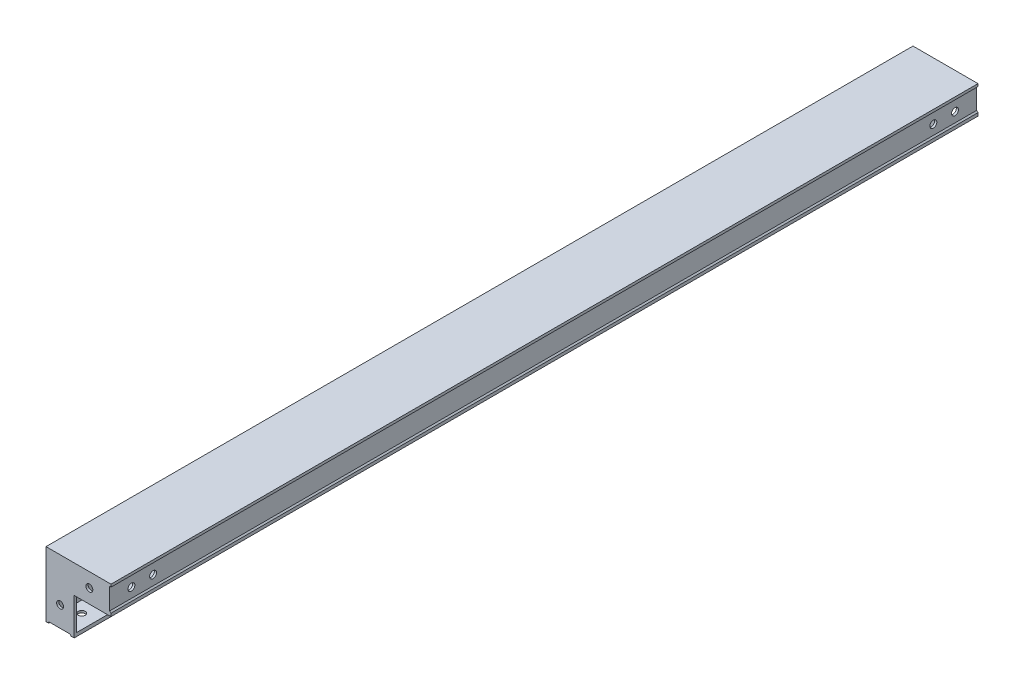
ISO-10303-21;
HEADER;
FILE_DESCRIPTION(('STEP AP214'),'2;1');
FILE_NAME('part.step','',(''),(''),'','','');
FILE_SCHEMA(('AUTOMOTIVE_DESIGN { 1 0 10303 214 1 1 1 1 }'));
ENDSEC;
DATA;
#1=APPLICATION_CONTEXT('core data for automotive mechanical design processes');
#2=APPLICATION_PROTOCOL_DEFINITION('international standard','automotive_design',2000,#1);
#3=PRODUCT_CONTEXT('',#1,'mechanical');
#4=PRODUCT('Part','Part','',(#3));
#5=PRODUCT_RELATED_PRODUCT_CATEGORY('part','',(#4));
#6=PRODUCT_DEFINITION_FORMATION('','',#4);
#7=PRODUCT_DEFINITION_CONTEXT('part definition',#1,'design');
#8=PRODUCT_DEFINITION('design','',#6,#7);
#9=PRODUCT_DEFINITION_SHAPE('','',#8);
#10=(LENGTH_UNIT() NAMED_UNIT(*) SI_UNIT(.MILLI.,.METRE.));
#11=(NAMED_UNIT(*) PLANE_ANGLE_UNIT() SI_UNIT($,.RADIAN.));
#12=(NAMED_UNIT(*) SI_UNIT($,.STERADIAN.) SOLID_ANGLE_UNIT());
#13=UNCERTAINTY_MEASURE_WITH_UNIT(LENGTH_MEASURE(1.E-05),#10,'distance_accuracy_value','');
#14=(GEOMETRIC_REPRESENTATION_CONTEXT(3) GLOBAL_UNCERTAINTY_ASSIGNED_CONTEXT((#13)) GLOBAL_UNIT_ASSIGNED_CONTEXT((#10,
#11,#12)) REPRESENTATION_CONTEXT('',''));
#15=CARTESIAN_POINT('',(0.,0.,0.));
#16=DIRECTION('',(0.,0.,1.));
#17=DIRECTION('',(1.,0.,0.));
#18=AXIS2_PLACEMENT_3D('',#15,#16,#17);
#19=CARTESIAN_POINT('',(54.9999999999997,-146.999999999985,2000.));
#20=DIRECTION('',(0.,1.,0.));
#21=DIRECTION('',(0.,0.,1.));
#22=AXIS2_PLACEMENT_3D('',#19,#20,#21);
#23=PLANE('',#22);
#24=CARTESIAN_POINT('',(32.5,-146.999999999985,1950.));
#25=DIRECTION('',(0.,-1.,0.));
#26=DIRECTION('',(0.,0.,-1.));
#27=AXIS2_PLACEMENT_3D('',#24,#25,#26);
#28=CIRCLE('',#27,7.99999999999999);
#29=CARTESIAN_POINT('',(32.5,-146.999999999985,1942.));
#30=VERTEX_POINT('',#29);
#31=EDGE_CURVE('E413',#30,#30,#28,.T.);
#32=ORIENTED_EDGE('',*,*,#31,.F.);
#33=EDGE_LOOP('',(#32));
#34=FACE_BOUND('',#33,.T.);
#35=CARTESIAN_POINT('',(32.5,-146.999999999985,50.));
#36=DIRECTION('',(0.,-1.,0.));
#37=DIRECTION('',(0.,0.,-1.));
#38=AXIS2_PLACEMENT_3D('',#35,#36,#37);
#39=CIRCLE('',#38,7.99999999999999);
#40=CARTESIAN_POINT('',(32.5,-146.999999999985,42.));
#41=VERTEX_POINT('',#40);
#42=EDGE_CURVE('E401',#41,#41,#39,.T.);
#43=ORIENTED_EDGE('',*,*,#42,.F.);
#44=EDGE_LOOP('',(#43));
#45=FACE_BOUND('',#44,.T.);
#46=CARTESIAN_POINT('',(32.5,-146.999999999985,100.));
#47=DIRECTION('',(0.,-1.,0.));
#48=DIRECTION('',(0.,0.,-1.));
#49=AXIS2_PLACEMENT_3D('',#46,#47,#48);
#50=CIRCLE('',#49,7.99999999999999);
#51=CARTESIAN_POINT('',(32.5,-146.999999999985,92.));
#52=VERTEX_POINT('',#51);
#53=EDGE_CURVE('E395',#52,#52,#50,.T.);
#54=ORIENTED_EDGE('',*,*,#53,.F.);
#55=EDGE_LOOP('',(#54));
#56=FACE_BOUND('',#55,.T.);
#57=DIRECTION('',(1.,0.,0.));
#58=VECTOR('',#57,1.);
#59=CARTESIAN_POINT('',(54.9999999999997,-146.999999999985,0.));
#60=LINE('',#59,#58);
#61=CARTESIAN_POINT('',(5.9999999999707,-146.999999999985,0.));
#62=VERTEX_POINT('',#61);
#63=CARTESIAN_POINT('',(54.9999999999997,-146.999999999985,0.));
#64=VERTEX_POINT('',#63);
#65=EDGE_CURVE('E290',#62,#64,#60,.T.);
#66=ORIENTED_EDGE('',*,*,#65,.T.);
#67=DIRECTION('',(0.,0.,-1.));
#68=VECTOR('',#67,1.);
#69=CARTESIAN_POINT('',(54.9999999999997,-146.999999999985,2000.));
#70=LINE('',#69,#68);
#71=CARTESIAN_POINT('',(54.9999999999997,-146.999999999985,2000.));
#72=VERTEX_POINT('',#71);
#73=EDGE_CURVE('E308',#72,#64,#70,.T.);
#74=ORIENTED_EDGE('',*,*,#73,.F.);
#75=DIRECTION('',(1.,0.,0.));
#76=VECTOR('',#75,1.);
#77=CARTESIAN_POINT('',(54.9999999999997,-146.999999999985,2000.));
#78=LINE('',#77,#76);
#79=CARTESIAN_POINT('',(5.9999999999707,-146.999999999985,2000.));
#80=VERTEX_POINT('',#79);
#81=EDGE_CURVE('E261',#80,#72,#78,.T.);
#82=ORIENTED_EDGE('',*,*,#81,.F.);
#83=DIRECTION('',(0.,0.,-1.));
#84=VECTOR('',#83,1.);
#85=CARTESIAN_POINT('',(5.9999999999707,-146.999999999985,2000.));
#86=LINE('',#85,#84);
#87=EDGE_CURVE('E311',#80,#62,#86,.T.);
#88=ORIENTED_EDGE('',*,*,#87,.T.);
#89=EDGE_LOOP('',(#66,#74,#82,#88));
#90=FACE_BOUND('',#89,.T.);
#91=CARTESIAN_POINT('',(32.5,-146.999999999985,1900.));
#92=DIRECTION('',(0.,-1.,0.));
#93=DIRECTION('',(0.,0.,-1.));
#94=AXIS2_PLACEMENT_3D('',#91,#92,#93);
#95=CIRCLE('',#94,7.99999999999999);
#96=CARTESIAN_POINT('',(32.5,-146.999999999985,1892.));
#97=VERTEX_POINT('',#96);
#98=EDGE_CURVE('E407',#97,#97,#95,.T.);
#99=ORIENTED_EDGE('',*,*,#98,.F.);
#100=EDGE_LOOP('',(#99));
#101=FACE_BOUND('',#100,.T.);
#102=ADVANCED_FACE('F38',(#34,#45,#56,#90,#101),#23,.F.);
#103=CARTESIAN_POINT('',(147.000000000021,-6.00000000000021,2000.));
#104=DIRECTION('',(-1.,0.,0.));
#105=DIRECTION('',(0.,-1.,0.));
#106=AXIS2_PLACEMENT_3D('',#103,#104,#105);
#107=PLANE('',#106);
#108=CARTESIAN_POINT('',(147.000000000021,-32.5,100.));
#109=DIRECTION('',(1.,0.,0.));
#110=DIRECTION('',(0.,0.,-1.));
#111=AXIS2_PLACEMENT_3D('',#108,#109,#110);
#112=CIRCLE('',#111,7.99999999999999);
#113=CARTESIAN_POINT('',(147.000000000021,-32.5,92.));
#114=VERTEX_POINT('',#113);
#115=EDGE_CURVE('E371',#114,#114,#112,.T.);
#116=ORIENTED_EDGE('',*,*,#115,.F.);
#117=EDGE_LOOP('',(#116));
#118=FACE_BOUND('',#117,.T.);
#119=DIRECTION('',(0.,1.,0.));
#120=VECTOR('',#119,1.);
#121=CARTESIAN_POINT('',(147.000000000021,-6.00000000000021,0.));
#122=LINE('',#121,#120);
#123=CARTESIAN_POINT('',(147.000000000021,-55.0000000000175,0.));
#124=VERTEX_POINT('',#123);
#125=CARTESIAN_POINT('',(147.000000000021,-6.00000000000021,0.));
#126=VERTEX_POINT('',#125);
#127=EDGE_CURVE('E276',#124,#126,#122,.T.);
#128=ORIENTED_EDGE('',*,*,#127,.T.);
#129=DIRECTION('',(0.,0.,-1.));
#130=VECTOR('',#129,1.);
#131=CARTESIAN_POINT('',(147.000000000021,-6.00000000000021,2000.));
#132=LINE('',#131,#130);
#133=CARTESIAN_POINT('',(147.000000000021,-6.00000000000021,2000.));
#134=VERTEX_POINT('',#133);
#135=EDGE_CURVE('E329',#134,#126,#132,.T.);
#136=ORIENTED_EDGE('',*,*,#135,.F.);
#137=DIRECTION('',(0.,1.,0.));
#138=VECTOR('',#137,1.);
#139=CARTESIAN_POINT('',(147.000000000021,-6.00000000000021,2000.));
#140=LINE('',#139,#138);
#141=CARTESIAN_POINT('',(147.000000000021,-55.0000000000175,2000.));
#142=VERTEX_POINT('',#141);
#143=EDGE_CURVE('E247',#142,#134,#140,.T.);
#144=ORIENTED_EDGE('',*,*,#143,.F.);
#145=DIRECTION('',(0.,0.,-1.));
#146=VECTOR('',#145,1.);
#147=CARTESIAN_POINT('',(147.000000000021,-55.0000000000175,2000.));
#148=LINE('',#147,#146);
#149=EDGE_CURVE('E332',#142,#124,#148,.T.);
#150=ORIENTED_EDGE('',*,*,#149,.T.);
#151=EDGE_LOOP('',(#128,#136,#144,#150));
#152=FACE_BOUND('',#151,.T.);
#153=CARTESIAN_POINT('',(147.000000000021,-32.5,50.));
#154=DIRECTION('',(1.,0.,0.));
#155=DIRECTION('',(0.,0.,-1.));
#156=AXIS2_PLACEMENT_3D('',#153,#154,#155);
#157=CIRCLE('',#156,7.99999999999999);
#158=CARTESIAN_POINT('',(147.000000000021,-32.5,42.));
#159=VERTEX_POINT('',#158);
#160=EDGE_CURVE('E377',#159,#159,#157,.T.);
#161=ORIENTED_EDGE('',*,*,#160,.F.);
#162=EDGE_LOOP('',(#161));
#163=FACE_BOUND('',#162,.T.);
#164=CARTESIAN_POINT('',(147.000000000021,-32.5,1900.));
#165=DIRECTION('',(1.,0.,0.));
#166=DIRECTION('',(0.,0.,-1.));
#167=AXIS2_PLACEMENT_3D('',#164,#165,#166);
#168=CIRCLE('',#167,7.99999999999999);
#169=CARTESIAN_POINT('',(147.000000000021,-32.5,1892.));
#170=VERTEX_POINT('',#169);
#171=EDGE_CURVE('E383',#170,#170,#168,.T.);
#172=ORIENTED_EDGE('',*,*,#171,.F.);
#173=EDGE_LOOP('',(#172));
#174=FACE_BOUND('',#173,.T.);
#175=CARTESIAN_POINT('',(147.000000000021,-32.5,1950.));
#176=DIRECTION('',(1.,0.,0.));
#177=DIRECTION('',(0.,0.,-1.));
#178=AXIS2_PLACEMENT_3D('',#175,#176,#177);
#179=CIRCLE('',#178,7.99999999999999);
#180=CARTESIAN_POINT('',(147.000000000021,-32.5,1942.));
#181=VERTEX_POINT('',#180);
#182=EDGE_CURVE('E389',#181,#181,#179,.T.);
#183=ORIENTED_EDGE('',*,*,#182,.F.);
#184=EDGE_LOOP('',(#183));
#185=FACE_BOUND('',#184,.T.);
#186=ADVANCED_FACE('F421',(#118,#152,#163,#174,#185),#107,.F.);
#187=CARTESIAN_POINT('',(8.99999999995733,-8.99999999998687,2000.));
#188=DIRECTION('',(0.,0.,-1.));
#189=DIRECTION('',(-1.,0.,0.));
#190=AXIS2_PLACEMENT_3D('',#187,#188,#189);
#191=CYLINDRICAL_SURFACE('',#190,2.99999999998663);
#192=DIRECTION('',(0.,0.,-1.));
#193=VECTOR('',#192,1.);
#194=CARTESIAN_POINT('',(5.9999999999707,-8.99999999998688,2000.));
#195=LINE('',#194,#193);
#196=CARTESIAN_POINT('',(5.9999999999707,-8.99999999998688,1995.));
#197=VERTEX_POINT('',#196);
#198=CARTESIAN_POINT('',(5.9999999999707,-8.99999999998688,4.99999999999989));
#199=VERTEX_POINT('',#198);
#200=EDGE_CURVE('E270',#197,#199,#195,.T.);
#201=ORIENTED_EDGE('',*,*,#200,.T.);
#202=CARTESIAN_POINT('',(8.99999999995733,-8.99999999998687,4.99999999999989));
#203=DIRECTION('',(0.,0.,1.));
#204=DIRECTION('',(1.,0.,0.));
#205=AXIS2_PLACEMENT_3D('',#202,#203,#204);
#206=CIRCLE('',#205,2.99999999998663);
#207=CARTESIAN_POINT('',(8.99999999995733,-6.00000000000025,4.99999999999989));
#208=VERTEX_POINT('',#207);
#209=EDGE_CURVE('E54',#199,#208,#206,.F.);
#210=ORIENTED_EDGE('',*,*,#209,.T.);
#211=DIRECTION('',(0.,0.,-1.));
#212=VECTOR('',#211,1.);
#213=CARTESIAN_POINT('',(8.99999999995733,-6.00000000000025,2000.));
#214=LINE('',#213,#212);
#215=CARTESIAN_POINT('',(8.99999999995733,-6.00000000000021,1995.));
#216=VERTEX_POINT('',#215);
#217=EDGE_CURVE('E11',#216,#208,#214,.T.);
#218=ORIENTED_EDGE('',*,*,#217,.F.);
#219=CARTESIAN_POINT('',(8.99999999995733,-8.99999999998687,1995.));
#220=DIRECTION('',(0.,0.,-1.));
#221=DIRECTION('',(-1.,0.,0.));
#222=AXIS2_PLACEMENT_3D('',#219,#220,#221);
#223=CIRCLE('',#222,2.99999999998663);
#224=EDGE_CURVE('E237',#216,#197,#223,.F.);
#225=ORIENTED_EDGE('',*,*,#224,.T.);
#226=EDGE_LOOP('',(#201,#210,#218,#225));
#227=FACE_BOUND('',#226,.T.);
#228=ADVANCED_FACE('F40',(#227),#191,.F.);
#229=CARTESIAN_POINT('',(8.99999999995733,-6.00000000000025,2000.));
#230=DIRECTION('',(0.,1.,0.));
#231=DIRECTION('',(-1.,0.,0.));
#232=AXIS2_PLACEMENT_3D('',#229,#230,#231);
#233=PLANE('',#232);
#234=ORIENTED_EDGE('',*,*,#217,.T.);
#235=DIRECTION('',(-1.,0.,0.));
#236=VECTOR('',#235,1.);
#237=CARTESIAN_POINT('',(5.9999999999707,-6.00000000000021,5.));
#238=LINE('',#237,#236);
#239=CARTESIAN_POINT('',(141.999999999995,-6.00000000000021,4.99999999999989));
#240=VERTEX_POINT('',#239);
#241=EDGE_CURVE('E60',#240,#208,#238,.T.);
#242=ORIENTED_EDGE('',*,*,#241,.F.);
#243=DIRECTION('',(0.,0.,-1.));
#244=VECTOR('',#243,1.);
#245=CARTESIAN_POINT('',(141.999999999995,-6.00000000000021,2000.));
#246=LINE('',#245,#244);
#247=CARTESIAN_POINT('',(141.999999999995,-6.00000000000021,1995.));
#248=VERTEX_POINT('',#247);
#249=EDGE_CURVE('E47',#248,#240,#246,.T.);
#250=ORIENTED_EDGE('',*,*,#249,.F.);
#251=DIRECTION('',(-1.,0.,0.));
#252=VECTOR('',#251,1.);
#253=CARTESIAN_POINT('',(5.9999999999707,-6.00000000000021,1995.));
#254=LINE('',#253,#252);
#255=EDGE_CURVE('E231',#248,#216,#254,.T.);
#256=ORIENTED_EDGE('',*,*,#255,.T.);
#257=EDGE_LOOP('',(#234,#242,#250,#256));
#258=FACE_BOUND('',#257,.T.);
#259=ADVANCED_FACE('F548',(#258),#233,.F.);
#260=CARTESIAN_POINT('',(141.999999999995,-64.9999999999834,2000.));
#261=DIRECTION('',(1.,0.,0.));
#262=DIRECTION('',(0.,0.,-1.));
#263=AXIS2_PLACEMENT_3D('',#260,#261,#262);
#264=PLANE('',#263);
#265=CARTESIAN_POINT('',(141.999999999995,-32.5,1950.));
#266=DIRECTION('',(1.,0.,0.));
#267=DIRECTION('',(0.,0.,-1.));
#268=AXIS2_PLACEMENT_3D('',#265,#266,#267);
#269=CIRCLE('',#268,7.99999999999999);
#270=CARTESIAN_POINT('',(141.999999999995,-32.5,1942.));
#271=VERTEX_POINT('',#270);
#272=EDGE_CURVE('E386',#271,#271,#269,.T.);
#273=ORIENTED_EDGE('',*,*,#272,.T.);
#274=EDGE_LOOP('',(#273));
#275=FACE_BOUND('',#274,.T.);
#276=CARTESIAN_POINT('',(141.999999999995,-32.5,1900.));
#277=DIRECTION('',(1.,0.,0.));
#278=DIRECTION('',(0.,0.,-1.));
#279=AXIS2_PLACEMENT_3D('',#276,#277,#278);
#280=CIRCLE('',#279,7.99999999999999);
#281=CARTESIAN_POINT('',(141.999999999995,-32.5,1892.));
#282=VERTEX_POINT('',#281);
#283=EDGE_CURVE('E380',#282,#282,#280,.T.);
#284=ORIENTED_EDGE('',*,*,#283,.T.);
#285=EDGE_LOOP('',(#284));
#286=FACE_BOUND('',#285,.T.);
#287=CARTESIAN_POINT('',(141.999999999995,-32.5,50.));
#288=DIRECTION('',(1.,0.,0.));
#289=DIRECTION('',(0.,0.,-1.));
#290=AXIS2_PLACEMENT_3D('',#287,#288,#289);
#291=CIRCLE('',#290,7.99999999999999);
#292=CARTESIAN_POINT('',(141.999999999995,-32.5,42.));
#293=VERTEX_POINT('',#292);
#294=EDGE_CURVE('E374',#293,#293,#291,.T.);
#295=ORIENTED_EDGE('',*,*,#294,.T.);
#296=EDGE_LOOP('',(#295));
#297=FACE_BOUND('',#296,.T.);
#298=CARTESIAN_POINT('',(141.999999999995,-32.5,100.));
#299=DIRECTION('',(1.,0.,0.));
#300=DIRECTION('',(0.,0.,-1.));
#301=AXIS2_PLACEMENT_3D('',#298,#299,#300);
#302=CIRCLE('',#301,7.99999999999999);
#303=CARTESIAN_POINT('',(141.999999999995,-32.5,92.));
#304=VERTEX_POINT('',#303);
#305=EDGE_CURVE('E368',#304,#304,#302,.T.);
#306=ORIENTED_EDGE('',*,*,#305,.T.);
#307=EDGE_LOOP('',(#306));
#308=FACE_BOUND('',#307,.T.);
#309=ORIENTED_EDGE('',*,*,#249,.T.);
#310=DIRECTION('',(0.,1.,0.));
#311=VECTOR('',#310,1.);
#312=CARTESIAN_POINT('',(141.999999999995,-64.9999999999834,5.));
#313=LINE('',#312,#311);
#314=CARTESIAN_POINT('',(141.999999999995,-64.9999999999834,4.99999999999989));
#315=VERTEX_POINT('',#314);
#316=EDGE_CURVE('E210',#315,#240,#313,.T.);
#317=ORIENTED_EDGE('',*,*,#316,.F.);
#318=DIRECTION('',(0.,0.,-1.));
#319=VECTOR('',#318,1.);
#320=CARTESIAN_POINT('',(141.999999999995,-64.9999999999834,2000.));
#321=LINE('',#320,#319);
#322=CARTESIAN_POINT('',(141.999999999995,-64.9999999999834,1995.));
#323=VERTEX_POINT('',#322);
#324=EDGE_CURVE('E209',#323,#315,#321,.T.);
#325=ORIENTED_EDGE('',*,*,#324,.F.);
#326=DIRECTION('',(0.,1.,0.));
#327=VECTOR('',#326,1.);
#328=CARTESIAN_POINT('',(141.999999999995,-64.9999999999834,1995.));
#329=LINE('',#328,#327);
#330=EDGE_CURVE('E228',#323,#248,#329,.T.);
#331=ORIENTED_EDGE('',*,*,#330,.T.);
#332=EDGE_LOOP('',(#309,#317,#325,#331));
#333=FACE_BOUND('',#332,.T.);
#334=ADVANCED_FACE('F343',(#275,#286,#297,#308,#333),#264,.F.);
#335=CARTESIAN_POINT('',(150.,-64.9999999999834,2000.));
#336=DIRECTION('',(0.,1.,0.));
#337=DIRECTION('',(0.,0.,1.));
#338=AXIS2_PLACEMENT_3D('',#335,#336,#337);
#339=PLANE('',#338);
#340=DIRECTION('',(1.,0.,0.));
#341=VECTOR('',#340,1.);
#342=CARTESIAN_POINT('',(150.,-64.9999999999834,0.));
#343=LINE('',#342,#341);
#344=CARTESIAN_POINT('',(64.9999999999995,-64.9999999999834,0.));
#345=VERTEX_POINT('',#344);
#346=CARTESIAN_POINT('',(150.,-64.9999999999834,0.));
#347=VERTEX_POINT('',#346);
#348=EDGE_CURVE('E240',#345,#347,#343,.T.);
#349=ORIENTED_EDGE('',*,*,#348,.T.);
#350=DIRECTION('',(0.,0.,-1.));
#351=VECTOR('',#350,1.);
#352=CARTESIAN_POINT('',(150.,-64.9999999999834,2000.));
#353=LINE('',#352,#351);
#354=CARTESIAN_POINT('',(150.,-64.9999999999834,2000.));
#355=VERTEX_POINT('',#354);
#356=EDGE_CURVE('E338',#355,#347,#353,.T.);
#357=ORIENTED_EDGE('',*,*,#356,.F.);
#358=DIRECTION('',(1.,0.,0.));
#359=VECTOR('',#358,1.);
#360=CARTESIAN_POINT('',(150.,-64.9999999999834,2000.));
#361=LINE('',#360,#359);
#362=CARTESIAN_POINT('',(64.9999999999995,-64.9999999999834,2000.));
#363=VERTEX_POINT('',#362);
#364=EDGE_CURVE('E241',#363,#355,#361,.T.);
#365=ORIENTED_EDGE('',*,*,#364,.F.);
#366=DIRECTION('',(0.,0.,1.));
#367=VECTOR('',#366,1.);
#368=CARTESIAN_POINT('',(64.9999999999995,-64.9999999999834,1995.));
#369=LINE('',#368,#367);
#370=CARTESIAN_POINT('',(64.9999999999995,-64.9999999999834,1995.));
#371=VERTEX_POINT('',#370);
#372=EDGE_CURVE('E234',#371,#363,#369,.T.);
#373=ORIENTED_EDGE('',*,*,#372,.F.);
#374=DIRECTION('',(1.,0.,0.));
#375=VECTOR('',#374,1.);
#376=CARTESIAN_POINT('',(141.999999999995,-64.9999999999834,1995.));
#377=LINE('',#376,#375);
#378=EDGE_CURVE('E226',#371,#323,#377,.T.);
#379=ORIENTED_EDGE('',*,*,#378,.T.);
#380=ORIENTED_EDGE('',*,*,#324,.T.);
#381=DIRECTION('',(1.,0.,0.));
#382=VECTOR('',#381,1.);
#383=CARTESIAN_POINT('',(141.999999999995,-64.9999999999834,5.));
#384=LINE('',#383,#382);
#385=CARTESIAN_POINT('',(64.9999999999995,-64.9999999999834,5.));
#386=VERTEX_POINT('',#385);
#387=EDGE_CURVE('E190',#386,#315,#384,.T.);
#388=ORIENTED_EDGE('',*,*,#387,.F.);
#389=DIRECTION('',(0.,0.,-1.));
#390=VECTOR('',#389,1.);
#391=CARTESIAN_POINT('',(64.9999999999995,-64.9999999999834,5.));
#392=LINE('',#391,#390);
#393=EDGE_CURVE('E197',#386,#345,#392,.T.);
#394=ORIENTED_EDGE('',*,*,#393,.T.);
#395=EDGE_LOOP('',(#349,#357,#365,#373,#379,#380,#388,#394));
#396=FACE_BOUND('',#395,.T.);
#397=ADVANCED_FACE('F206',(#396),#339,.F.);
#398=CARTESIAN_POINT('',(150.,-57.9999999999965,2000.));
#399=DIRECTION('',(-1.,0.,0.));
#400=DIRECTION('',(0.,0.,1.));
#401=AXIS2_PLACEMENT_3D('',#398,#399,#400);
#402=PLANE('',#401);
#403=DIRECTION('',(0.,1.,0.));
#404=VECTOR('',#403,1.);
#405=CARTESIAN_POINT('',(150.,-57.9999999999965,0.));
#406=LINE('',#405,#404);
#407=CARTESIAN_POINT('',(150.,-57.9999999999965,0.));
#408=VERTEX_POINT('',#407);
#409=EDGE_CURVE('E272',#347,#408,#406,.T.);
#410=ORIENTED_EDGE('',*,*,#409,.T.);
#411=DIRECTION('',(0.,0.,-1.));
#412=VECTOR('',#411,1.);
#413=CARTESIAN_POINT('',(150.,-57.9999999999965,2000.));
#414=LINE('',#413,#412);
#415=CARTESIAN_POINT('',(150.,-57.9999999999965,2000.));
#416=VERTEX_POINT('',#415);
#417=EDGE_CURVE('E335',#416,#408,#414,.T.);
#418=ORIENTED_EDGE('',*,*,#417,.F.);
#419=DIRECTION('',(0.,1.,0.));
#420=VECTOR('',#419,1.);
#421=CARTESIAN_POINT('',(150.,-57.9999999999965,2000.));
#422=LINE('',#421,#420);
#423=EDGE_CURVE('E243',#355,#416,#422,.T.);
#424=ORIENTED_EDGE('',*,*,#423,.F.);
#425=ORIENTED_EDGE('',*,*,#356,.T.);
#426=EDGE_LOOP('',(#410,#418,#424,#425));
#427=FACE_BOUND('',#426,.T.);
#428=ADVANCED_FACE('F540',(#427),#402,.F.);
#429=CARTESIAN_POINT('',(147.000000000021,-55.0000000000175,2000.));
#430=DIRECTION('',(-0.707106781186532,-0.707106781186563,0.));
#431=DIRECTION('',(0.707106781186563,-0.707106781186532,0.));
#432=AXIS2_PLACEMENT_3D('',#429,#430,#431);
#433=PLANE('',#432);
#434=DIRECTION('',(-0.707106781186563,0.707106781186532,0.));
#435=VECTOR('',#434,1.);
#436=CARTESIAN_POINT('',(147.000000000021,-55.0000000000175,0.));
#437=LINE('',#436,#435);
#438=EDGE_CURVE('E274',#408,#124,#437,.T.);
#439=ORIENTED_EDGE('',*,*,#438,.T.);
#440=ORIENTED_EDGE('',*,*,#149,.F.);
#441=DIRECTION('',(-0.707106781186563,0.707106781186532,0.));
#442=VECTOR('',#441,1.);
#443=CARTESIAN_POINT('',(147.000000000021,-55.0000000000175,2000.));
#444=LINE('',#443,#442);
#445=EDGE_CURVE('E245',#416,#142,#444,.T.);
#446=ORIENTED_EDGE('',*,*,#445,.F.);
#447=ORIENTED_EDGE('',*,*,#417,.T.);
#448=EDGE_LOOP('',(#439,#440,#446,#447));
#449=FACE_BOUND('',#448,.T.);
#450=ADVANCED_FACE('F533',(#449),#433,.F.);
#451=CARTESIAN_POINT('',(147.000000000021,-6.00000000000021,2000.));
#452=DIRECTION('',(0.,1.,0.));
#453=DIRECTION('',(-1.,0.,0.));
#454=AXIS2_PLACEMENT_3D('',#451,#452,#453);
#455=PLANE('',#454);
#456=DIRECTION('',(1.,0.,0.));
#457=VECTOR('',#456,1.);
#458=CARTESIAN_POINT('',(147.000000000021,-6.00000000000021,0.));
#459=LINE('',#458,#457);
#460=CARTESIAN_POINT('',(150.,-6.0000000000002,0.));
#461=VERTEX_POINT('',#460);
#462=EDGE_CURVE('E278',#126,#461,#459,.T.);
#463=ORIENTED_EDGE('',*,*,#462,.T.);
#464=DIRECTION('',(0.,0.,-1.));
#465=VECTOR('',#464,1.);
#466=CARTESIAN_POINT('',(150.,-6.0000000000002,2000.));
#467=LINE('',#466,#465);
#468=CARTESIAN_POINT('',(150.,-6.0000000000002,2000.));
#469=VERTEX_POINT('',#468);
#470=EDGE_CURVE('E326',#469,#461,#467,.T.);
#471=ORIENTED_EDGE('',*,*,#470,.F.);
#472=DIRECTION('',(1.,0.,0.));
#473=VECTOR('',#472,1.);
#474=CARTESIAN_POINT('',(147.000000000021,-6.00000000000021,2000.));
#475=LINE('',#474,#473);
#476=EDGE_CURVE('E249',#134,#469,#475,.T.);
#477=ORIENTED_EDGE('',*,*,#476,.F.);
#478=ORIENTED_EDGE('',*,*,#135,.T.);
#479=EDGE_LOOP('',(#463,#471,#477,#478));
#480=FACE_BOUND('',#479,.T.);
#481=ADVANCED_FACE('F529',(#480),#455,.F.);
#482=CARTESIAN_POINT('',(150.,0.,2000.));
#483=DIRECTION('',(-1.,0.,0.));
#484=DIRECTION('',(0.,0.,1.));
#485=AXIS2_PLACEMENT_3D('',#482,#483,#484);
#486=PLANE('',#485);
#487=DIRECTION('',(0.,1.,0.));
#488=VECTOR('',#487,1.);
#489=CARTESIAN_POINT('',(150.,0.,0.));
#490=LINE('',#489,#488);
#491=CARTESIAN_POINT('',(150.,0.,0.));
#492=VERTEX_POINT('',#491);
#493=EDGE_CURVE('E280',#461,#492,#490,.T.);
#494=ORIENTED_EDGE('',*,*,#493,.T.);
#495=DIRECTION('',(0.,0.,-1.));
#496=VECTOR('',#495,1.);
#497=CARTESIAN_POINT('',(150.,0.,2000.));
#498=LINE('',#497,#496);
#499=CARTESIAN_POINT('',(150.,0.,2000.));
#500=VERTEX_POINT('',#499);
#501=EDGE_CURVE('E323',#500,#492,#498,.T.);
#502=ORIENTED_EDGE('',*,*,#501,.F.);
#503=DIRECTION('',(0.,1.,0.));
#504=VECTOR('',#503,1.);
#505=CARTESIAN_POINT('',(150.,0.,2000.));
#506=LINE('',#505,#504);
#507=EDGE_CURVE('E251',#469,#500,#506,.T.);
#508=ORIENTED_EDGE('',*,*,#507,.F.);
#509=ORIENTED_EDGE('',*,*,#470,.T.);
#510=EDGE_LOOP('',(#494,#502,#508,#509));
#511=FACE_BOUND('',#510,.T.);
#512=ADVANCED_FACE('F525',(#511),#486,.F.);
#513=CARTESIAN_POINT('',(150.,0.,2000.));
#514=DIRECTION('',(0.,-1.,0.));
#515=DIRECTION('',(1.,0.,0.));
#516=AXIS2_PLACEMENT_3D('',#513,#514,#515);
#517=PLANE('',#516);
#518=DIRECTION('',(-1.,0.,0.));
#519=VECTOR('',#518,1.);
#520=CARTESIAN_POINT('',(150.,0.,0.));
#521=LINE('',#520,#519);
#522=CARTESIAN_POINT('',(0.,0.,0.));
#523=VERTEX_POINT('',#522);
#524=EDGE_CURVE('E282',#492,#523,#521,.T.);
#525=ORIENTED_EDGE('',*,*,#524,.T.);
#526=DIRECTION('',(0.,0.,-1.));
#527=VECTOR('',#526,1.);
#528=CARTESIAN_POINT('',(0.,0.,2000.));
#529=LINE('',#528,#527);
#530=CARTESIAN_POINT('',(0.,0.,2000.));
#531=VERTEX_POINT('',#530);
#532=EDGE_CURVE('E320',#531,#523,#529,.T.);
#533=ORIENTED_EDGE('',*,*,#532,.F.);
#534=DIRECTION('',(-1.,0.,0.));
#535=VECTOR('',#534,1.);
#536=CARTESIAN_POINT('',(150.,0.,2000.));
#537=LINE('',#536,#535);
#538=EDGE_CURVE('E253',#500,#531,#537,.T.);
#539=ORIENTED_EDGE('',*,*,#538,.F.);
#540=ORIENTED_EDGE('',*,*,#501,.T.);
#541=EDGE_LOOP('',(#525,#533,#539,#540));
#542=FACE_BOUND('',#541,.T.);
#543=ADVANCED_FACE('F521',(#542),#517,.F.);
#544=CARTESIAN_POINT('',(0.,-149.999999999985,2000.));
#545=DIRECTION('',(1.,0.,0.));
#546=DIRECTION('',(0.,0.,-1.));
#547=AXIS2_PLACEMENT_3D('',#544,#545,#546);
#548=PLANE('',#547);
#549=DIRECTION('',(0.,-1.,0.));
#550=VECTOR('',#549,1.);
#551=CARTESIAN_POINT('',(0.,-149.999999999985,0.));
#552=LINE('',#551,#550);
#553=CARTESIAN_POINT('',(0.,-149.999999999985,0.));
#554=VERTEX_POINT('',#553);
#555=EDGE_CURVE('E284',#523,#554,#552,.T.);
#556=ORIENTED_EDGE('',*,*,#555,.T.);
#557=DIRECTION('',(0.,0.,-1.));
#558=VECTOR('',#557,1.);
#559=CARTESIAN_POINT('',(0.,-149.999999999985,2000.));
#560=LINE('',#559,#558);
#561=CARTESIAN_POINT('',(0.,-149.999999999985,2000.));
#562=VERTEX_POINT('',#561);
#563=EDGE_CURVE('E317',#562,#554,#560,.T.);
#564=ORIENTED_EDGE('',*,*,#563,.F.);
#565=DIRECTION('',(0.,-1.,0.));
#566=VECTOR('',#565,1.);
#567=CARTESIAN_POINT('',(0.,-149.999999999985,2000.));
#568=LINE('',#567,#566);
#569=EDGE_CURVE('E255',#531,#562,#568,.T.);
#570=ORIENTED_EDGE('',*,*,#569,.F.);
#571=ORIENTED_EDGE('',*,*,#532,.T.);
#572=EDGE_LOOP('',(#556,#564,#570,#571));
#573=FACE_BOUND('',#572,.T.);
#574=ADVANCED_FACE('F517',(#573),#548,.F.);
#575=CARTESIAN_POINT('',(5.9999999999707,-149.999999999985,2000.));
#576=DIRECTION('',(0.,1.,0.));
#577=DIRECTION('',(0.,0.,1.));
#578=AXIS2_PLACEMENT_3D('',#575,#576,#577);
#579=PLANE('',#578);
#580=DIRECTION('',(1.,0.,0.));
#581=VECTOR('',#580,1.);
#582=CARTESIAN_POINT('',(5.9999999999707,-149.999999999985,0.));
#583=LINE('',#582,#581);
#584=CARTESIAN_POINT('',(5.9999999999707,-149.999999999985,0.));
#585=VERTEX_POINT('',#584);
#586=EDGE_CURVE('E286',#554,#585,#583,.T.);
#587=ORIENTED_EDGE('',*,*,#586,.T.);
#588=DIRECTION('',(0.,0.,-1.));
#589=VECTOR('',#588,1.);
#590=CARTESIAN_POINT('',(5.9999999999707,-149.999999999985,2000.));
#591=LINE('',#590,#589);
#592=CARTESIAN_POINT('',(5.9999999999707,-149.999999999985,2000.));
#593=VERTEX_POINT('',#592);
#594=EDGE_CURVE('E314',#593,#585,#591,.T.);
#595=ORIENTED_EDGE('',*,*,#594,.F.);
#596=DIRECTION('',(1.,0.,0.));
#597=VECTOR('',#596,1.);
#598=CARTESIAN_POINT('',(5.9999999999707,-149.999999999985,2000.));
#599=LINE('',#598,#597);
#600=EDGE_CURVE('E257',#562,#593,#599,.T.);
#601=ORIENTED_EDGE('',*,*,#600,.F.);
#602=ORIENTED_EDGE('',*,*,#563,.T.);
#603=EDGE_LOOP('',(#587,#595,#601,#602));
#604=FACE_BOUND('',#603,.T.);
#605=ADVANCED_FACE('F513',(#604),#579,.F.);
#606=CARTESIAN_POINT('',(5.9999999999707,-149.999999999985,2000.));
#607=DIRECTION('',(-1.,0.,0.));
#608=DIRECTION('',(0.,-1.,0.));
#609=AXIS2_PLACEMENT_3D('',#606,#607,#608);
#610=PLANE('',#609);
#611=DIRECTION('',(0.,1.,0.));
#612=VECTOR('',#611,1.);
#613=CARTESIAN_POINT('',(5.9999999999707,-149.999999999985,0.));
#614=LINE('',#613,#612);
#615=EDGE_CURVE('E288',#585,#62,#614,.T.);
#616=ORIENTED_EDGE('',*,*,#615,.T.);
#617=ORIENTED_EDGE('',*,*,#87,.F.);
#618=DIRECTION('',(0.,1.,0.));
#619=VECTOR('',#618,1.);
#620=CARTESIAN_POINT('',(5.9999999999707,-149.999999999985,2000.));
#621=LINE('',#620,#619);
#622=EDGE_CURVE('E259',#593,#80,#621,.T.);
#623=ORIENTED_EDGE('',*,*,#622,.F.);
#624=ORIENTED_EDGE('',*,*,#594,.T.);
#625=EDGE_LOOP('',(#616,#617,#623,#624));
#626=FACE_BOUND('',#625,.T.);
#627=ADVANCED_FACE('F508',(#626),#610,.F.);
#628=CARTESIAN_POINT('',(57.9999999999998,-149.999999999985,2000.));
#629=DIRECTION('',(0.707106781186547,0.707106781186548,0.));
#630=DIRECTION('',(-0.707106781186548,0.707106781186547,0.));
#631=AXIS2_PLACEMENT_3D('',#628,#629,#630);
#632=PLANE('',#631);
#633=DIRECTION('',(0.707106781186548,-0.707106781186547,0.));
#634=VECTOR('',#633,1.);
#635=CARTESIAN_POINT('',(57.9999999999998,-149.999999999985,0.));
#636=LINE('',#635,#634);
#637=CARTESIAN_POINT('',(57.9999999999998,-149.999999999985,0.));
#638=VERTEX_POINT('',#637);
#639=EDGE_CURVE('E292',#64,#638,#636,.T.);
#640=ORIENTED_EDGE('',*,*,#639,.T.);
#641=DIRECTION('',(0.,0.,-1.));
#642=VECTOR('',#641,1.);
#643=CARTESIAN_POINT('',(57.9999999999998,-149.999999999985,2000.));
#644=LINE('',#643,#642);
#645=CARTESIAN_POINT('',(57.9999999999998,-149.999999999985,2000.));
#646=VERTEX_POINT('',#645);
#647=EDGE_CURVE('E305',#646,#638,#644,.T.);
#648=ORIENTED_EDGE('',*,*,#647,.F.);
#649=DIRECTION('',(0.707106781186548,-0.707106781186547,0.));
#650=VECTOR('',#649,1.);
#651=CARTESIAN_POINT('',(57.9999999999998,-149.999999999985,2000.));
#652=LINE('',#651,#650);
#653=EDGE_CURVE('E263',#72,#646,#652,.T.);
#654=ORIENTED_EDGE('',*,*,#653,.F.);
#655=ORIENTED_EDGE('',*,*,#73,.T.);
#656=EDGE_LOOP('',(#640,#648,#654,#655));
#657=FACE_BOUND('',#656,.T.);
#658=ADVANCED_FACE('F505',(#657),#632,.F.);
#659=CARTESIAN_POINT('',(57.9999999999998,-149.999999999985,2000.));
#660=DIRECTION('',(0.,1.,0.));
#661=DIRECTION('',(0.,0.,1.));
#662=AXIS2_PLACEMENT_3D('',#659,#660,#661);
#663=PLANE('',#662);
#664=DIRECTION('',(1.,0.,0.));
#665=VECTOR('',#664,1.);
#666=CARTESIAN_POINT('',(57.9999999999998,-149.999999999985,0.));
#667=LINE('',#666,#665);
#668=CARTESIAN_POINT('',(64.9999999999995,-149.999999999985,0.));
#669=VERTEX_POINT('',#668);
#670=EDGE_CURVE('E294',#638,#669,#667,.T.);
#671=ORIENTED_EDGE('',*,*,#670,.T.);
#672=DIRECTION('',(0.,0.,-1.));
#673=VECTOR('',#672,1.);
#674=CARTESIAN_POINT('',(64.9999999999995,-149.999999999985,2000.));
#675=LINE('',#674,#673);
#676=CARTESIAN_POINT('',(64.9999999999995,-149.999999999985,2000.));
#677=VERTEX_POINT('',#676);
#678=EDGE_CURVE('E303',#677,#669,#675,.T.);
#679=ORIENTED_EDGE('',*,*,#678,.F.);
#680=DIRECTION('',(1.,0.,0.));
#681=VECTOR('',#680,1.);
#682=CARTESIAN_POINT('',(57.9999999999998,-149.999999999985,2000.));
#683=LINE('',#682,#681);
#684=EDGE_CURVE('E265',#646,#677,#683,.T.);
#685=ORIENTED_EDGE('',*,*,#684,.F.);
#686=ORIENTED_EDGE('',*,*,#647,.T.);
#687=EDGE_LOOP('',(#671,#679,#685,#686));
#688=FACE_BOUND('',#687,.T.);
#689=ADVANCED_FACE('F502',(#688),#663,.F.);
#690=CARTESIAN_POINT('',(64.9999999999995,-149.999999999985,2000.));
#691=DIRECTION('',(-1.,0.,0.));
#692=DIRECTION('',(0.,0.,1.));
#693=AXIS2_PLACEMENT_3D('',#690,#691,#692);
#694=PLANE('',#693);
#695=DIRECTION('',(0.,1.,0.));
#696=VECTOR('',#695,1.);
#697=CARTESIAN_POINT('',(64.9999999999995,-149.999999999985,0.));
#698=LINE('',#697,#696);
#699=EDGE_CURVE('E201',#669,#345,#698,.T.);
#700=ORIENTED_EDGE('',*,*,#699,.T.);
#701=ORIENTED_EDGE('',*,*,#393,.F.);
#702=DIRECTION('',(0.,1.,0.));
#703=VECTOR('',#702,1.);
#704=CARTESIAN_POINT('',(64.9999999999995,-141.999999999999,5.));
#705=LINE('',#704,#703);
#706=CARTESIAN_POINT('',(64.9999999999995,-141.999999999999,4.99999999999989));
#707=VERTEX_POINT('',#706);
#708=EDGE_CURVE('E185',#707,#386,#705,.T.);
#709=ORIENTED_EDGE('',*,*,#708,.F.);
#710=DIRECTION('',(0.,0.,-1.));
#711=VECTOR('',#710,1.);
#712=CARTESIAN_POINT('',(64.9999999999995,-141.999999999999,2000.));
#713=LINE('',#712,#711);
#714=CARTESIAN_POINT('',(64.9999999999995,-141.999999999999,1995.));
#715=VERTEX_POINT('',#714);
#716=EDGE_CURVE('E301',#715,#707,#713,.T.);
#717=ORIENTED_EDGE('',*,*,#716,.F.);
#718=DIRECTION('',(0.,1.,0.));
#719=VECTOR('',#718,1.);
#720=CARTESIAN_POINT('',(64.9999999999995,-141.999999999999,1995.));
#721=LINE('',#720,#719);
#722=EDGE_CURVE('E223',#715,#371,#721,.T.);
#723=ORIENTED_EDGE('',*,*,#722,.T.);
#724=ORIENTED_EDGE('',*,*,#372,.T.);
#725=DIRECTION('',(0.,1.,0.));
#726=VECTOR('',#725,1.);
#727=CARTESIAN_POINT('',(64.9999999999995,-149.999999999985,2000.));
#728=LINE('',#727,#726);
#729=EDGE_CURVE('E267',#677,#363,#728,.T.);
#730=ORIENTED_EDGE('',*,*,#729,.F.);
#731=ORIENTED_EDGE('',*,*,#678,.T.);
#732=EDGE_LOOP('',(#700,#701,#709,#717,#723,#724,#730,#731));
#733=FACE_BOUND('',#732,.T.);
#734=ADVANCED_FACE('F198',(#733),#694,.F.);
#735=CARTESIAN_POINT('',(5.9999999999707,-141.999999999999,2000.));
#736=DIRECTION('',(0.,-1.,0.));
#737=DIRECTION('',(0.,0.,-1.));
#738=AXIS2_PLACEMENT_3D('',#735,#736,#737);
#739=PLANE('',#738);
#740=CARTESIAN_POINT('',(32.5,-141.999999999999,1950.));
#741=DIRECTION('',(0.,-1.,0.));
#742=DIRECTION('',(0.,0.,-1.));
#743=AXIS2_PLACEMENT_3D('',#740,#741,#742);
#744=CIRCLE('',#743,7.99999999999999);
#745=CARTESIAN_POINT('',(32.5,-141.999999999999,1942.));
#746=VERTEX_POINT('',#745);
#747=EDGE_CURVE('E410',#746,#746,#744,.T.);
#748=ORIENTED_EDGE('',*,*,#747,.T.);
#749=EDGE_LOOP('',(#748));
#750=FACE_BOUND('',#749,.T.);
#751=CARTESIAN_POINT('',(32.5,-141.999999999999,1900.));
#752=DIRECTION('',(0.,-1.,0.));
#753=DIRECTION('',(0.,0.,-1.));
#754=AXIS2_PLACEMENT_3D('',#751,#752,#753);
#755=CIRCLE('',#754,7.99999999999999);
#756=CARTESIAN_POINT('',(32.5,-141.999999999999,1892.));
#757=VERTEX_POINT('',#756);
#758=EDGE_CURVE('E404',#757,#757,#755,.T.);
#759=ORIENTED_EDGE('',*,*,#758,.T.);
#760=EDGE_LOOP('',(#759));
#761=FACE_BOUND('',#760,.T.);
#762=CARTESIAN_POINT('',(32.5,-141.999999999999,50.));
#763=DIRECTION('',(0.,-1.,0.));
#764=DIRECTION('',(0.,0.,-1.));
#765=AXIS2_PLACEMENT_3D('',#762,#763,#764);
#766=CIRCLE('',#765,7.99999999999999);
#767=CARTESIAN_POINT('',(32.5,-141.999999999999,42.));
#768=VERTEX_POINT('',#767);
#769=EDGE_CURVE('E398',#768,#768,#766,.T.);
#770=ORIENTED_EDGE('',*,*,#769,.T.);
#771=EDGE_LOOP('',(#770));
#772=FACE_BOUND('',#771,.T.);
#773=CARTESIAN_POINT('',(32.5,-141.999999999999,100.));
#774=DIRECTION('',(0.,-1.,0.));
#775=DIRECTION('',(0.,0.,-1.));
#776=AXIS2_PLACEMENT_3D('',#773,#774,#775);
#777=CIRCLE('',#776,7.99999999999999);
#778=CARTESIAN_POINT('',(32.5,-141.999999999999,92.));
#779=VERTEX_POINT('',#778);
#780=EDGE_CURVE('E392',#779,#779,#777,.T.);
#781=ORIENTED_EDGE('',*,*,#780,.T.);
#782=EDGE_LOOP('',(#781));
#783=FACE_BOUND('',#782,.T.);
#784=ORIENTED_EDGE('',*,*,#716,.T.);
#785=DIRECTION('',(1.,0.,0.));
#786=VECTOR('',#785,1.);
#787=CARTESIAN_POINT('',(5.9999999999707,-141.999999999999,5.));
#788=LINE('',#787,#786);
#789=CARTESIAN_POINT('',(5.9999999999707,-141.999999999999,4.99999999999989));
#790=VERTEX_POINT('',#789);
#791=EDGE_CURVE('E192',#790,#707,#788,.T.);
#792=ORIENTED_EDGE('',*,*,#791,.F.);
#793=DIRECTION('',(0.,0.,-1.));
#794=VECTOR('',#793,1.);
#795=CARTESIAN_POINT('',(5.9999999999707,-141.999999999999,2000.));
#796=LINE('',#795,#794);
#797=CARTESIAN_POINT('',(5.9999999999707,-141.999999999999,1995.));
#798=VERTEX_POINT('',#797);
#799=EDGE_CURVE('E298',#798,#790,#796,.T.);
#800=ORIENTED_EDGE('',*,*,#799,.F.);
#801=DIRECTION('',(1.,0.,0.));
#802=VECTOR('',#801,1.);
#803=CARTESIAN_POINT('',(5.9999999999707,-141.999999999999,1995.));
#804=LINE('',#803,#802);
#805=EDGE_CURVE('E220',#798,#715,#804,.T.);
#806=ORIENTED_EDGE('',*,*,#805,.T.);
#807=EDGE_LOOP('',(#784,#792,#800,#806));
#808=FACE_BOUND('',#807,.T.);
#809=ADVANCED_FACE('F495',(#750,#761,#772,#783,#808),#739,.F.);
#810=CARTESIAN_POINT('',(5.9999999999707,-141.999999999999,2000.));
#811=DIRECTION('',(-1.,0.,0.));
#812=DIRECTION('',(0.,0.,1.));
#813=AXIS2_PLACEMENT_3D('',#810,#811,#812);
#814=PLANE('',#813);
#815=ORIENTED_EDGE('',*,*,#799,.T.);
#816=DIRECTION('',(0.,-1.,0.));
#817=VECTOR('',#816,1.);
#818=CARTESIAN_POINT('',(5.9999999999707,-141.999999999999,5.));
#819=LINE('',#818,#817);
#820=EDGE_CURVE('E344',#199,#790,#819,.T.);
#821=ORIENTED_EDGE('',*,*,#820,.F.);
#822=ORIENTED_EDGE('',*,*,#200,.F.);
#823=DIRECTION('',(0.,-1.,0.));
#824=VECTOR('',#823,1.);
#825=CARTESIAN_POINT('',(5.9999999999707,-141.999999999999,1995.));
#826=LINE('',#825,#824);
#827=EDGE_CURVE('E217',#197,#798,#826,.T.);
#828=ORIENTED_EDGE('',*,*,#827,.T.);
#829=EDGE_LOOP('',(#815,#821,#822,#828));
#830=FACE_BOUND('',#829,.T.);
#831=ADVANCED_FACE('F488',(#830),#814,.F.);
#832=CARTESIAN_POINT('',(8.99999999995733,-8.99999999998687,2000.));
#833=DIRECTION('',(0.,0.,1.));
#834=DIRECTION('',(1.,0.,0.));
#835=AXIS2_PLACEMENT_3D('',#832,#833,#834);
#836=PLANE('',#835);
#837=CARTESIAN_POINT('',(100.,-32.5,2000.));
#838=DIRECTION('',(0.,0.,1.));
#839=DIRECTION('',(1.,0.,0.));
#840=AXIS2_PLACEMENT_3D('',#837,#838,#839);
#841=CIRCLE('',#840,7.99999999999999);
#842=CARTESIAN_POINT('',(108.,-32.5,2000.));
#843=VERTEX_POINT('',#842);
#844=EDGE_CURVE('E365',#843,#843,#841,.T.);
#845=ORIENTED_EDGE('',*,*,#844,.F.);
#846=EDGE_LOOP('',(#845));
#847=FACE_BOUND('',#846,.T.);
#848=CARTESIAN_POINT('',(32.5,-99.9999999999851,2000.));
#849=DIRECTION('',(0.,0.,1.));
#850=DIRECTION('',(1.,0.,0.));
#851=AXIS2_PLACEMENT_3D('',#848,#849,#850);
#852=CIRCLE('',#851,7.99999999999999);
#853=CARTESIAN_POINT('',(40.5,-99.9999999999851,2000.));
#854=VERTEX_POINT('',#853);
#855=EDGE_CURVE('E353',#854,#854,#852,.T.);
#856=ORIENTED_EDGE('',*,*,#855,.F.);
#857=EDGE_LOOP('',(#856));
#858=FACE_BOUND('',#857,.T.);
#859=ORIENTED_EDGE('',*,*,#729,.T.);
#860=ORIENTED_EDGE('',*,*,#364,.T.);
#861=ORIENTED_EDGE('',*,*,#423,.T.);
#862=ORIENTED_EDGE('',*,*,#445,.T.);
#863=ORIENTED_EDGE('',*,*,#143,.T.);
#864=ORIENTED_EDGE('',*,*,#476,.T.);
#865=ORIENTED_EDGE('',*,*,#507,.T.);
#866=ORIENTED_EDGE('',*,*,#538,.T.);
#867=ORIENTED_EDGE('',*,*,#569,.T.);
#868=ORIENTED_EDGE('',*,*,#600,.T.);
#869=ORIENTED_EDGE('',*,*,#622,.T.);
#870=ORIENTED_EDGE('',*,*,#81,.T.);
#871=ORIENTED_EDGE('',*,*,#653,.T.);
#872=ORIENTED_EDGE('',*,*,#684,.T.);
#873=EDGE_LOOP('',(#859,#860,#861,#862,#863,#864,#865,#866,#867,#868,#869,#870,#871,#872));
#874=FACE_BOUND('',#873,.T.);
#875=ADVANCED_FACE('F485',(#847,#858,#874),#836,.T.);
#876=CARTESIAN_POINT('',(8.99999999995733,-8.99999999998687,0.));
#877=DIRECTION('',(0.,0.,1.));
#878=DIRECTION('',(1.,0.,0.));
#879=AXIS2_PLACEMENT_3D('',#876,#877,#878);
#880=PLANE('',#879);
#881=CARTESIAN_POINT('',(100.,-32.5,0.));
#882=DIRECTION('',(0.,0.,1.));
#883=DIRECTION('',(1.,0.,0.));
#884=AXIS2_PLACEMENT_3D('',#881,#882,#883);
#885=CIRCLE('',#884,7.99999999999976);
#886=CARTESIAN_POINT('',(108.,-32.5,0.));
#887=VERTEX_POINT('',#886);
#888=EDGE_CURVE('E362',#887,#887,#885,.T.);
#889=ORIENTED_EDGE('',*,*,#888,.T.);
#890=EDGE_LOOP('',(#889));
#891=FACE_BOUND('',#890,.T.);
#892=CARTESIAN_POINT('',(32.5,-99.9999999999851,0.));
#893=DIRECTION('',(0.,0.,1.));
#894=DIRECTION('',(1.,0.,0.));
#895=AXIS2_PLACEMENT_3D('',#892,#893,#894);
#896=CIRCLE('',#895,7.99999999999976);
#897=CARTESIAN_POINT('',(40.4999999999998,-99.9999999999851,0.));
#898=VERTEX_POINT('',#897);
#899=EDGE_CURVE('E350',#898,#898,#896,.T.);
#900=ORIENTED_EDGE('',*,*,#899,.T.);
#901=EDGE_LOOP('',(#900));
#902=FACE_BOUND('',#901,.T.);
#903=ORIENTED_EDGE('',*,*,#348,.F.);
#904=ORIENTED_EDGE('',*,*,#699,.F.);
#905=ORIENTED_EDGE('',*,*,#670,.F.);
#906=ORIENTED_EDGE('',*,*,#639,.F.);
#907=ORIENTED_EDGE('',*,*,#65,.F.);
#908=ORIENTED_EDGE('',*,*,#615,.F.);
#909=ORIENTED_EDGE('',*,*,#586,.F.);
#910=ORIENTED_EDGE('',*,*,#555,.F.);
#911=ORIENTED_EDGE('',*,*,#524,.F.);
#912=ORIENTED_EDGE('',*,*,#493,.F.);
#913=ORIENTED_EDGE('',*,*,#462,.F.);
#914=ORIENTED_EDGE('',*,*,#127,.F.);
#915=ORIENTED_EDGE('',*,*,#438,.F.);
#916=ORIENTED_EDGE('',*,*,#409,.F.);
#917=EDGE_LOOP('',(#903,#904,#905,#906,#907,#908,#909,#910,#911,#912,#913,#914,#915,#916));
#918=FACE_BOUND('',#917,.T.);
#919=ADVANCED_FACE('F483',(#891,#902,#918),#880,.F.);
#920=CARTESIAN_POINT('',(0.,0.,1995.));
#921=DIRECTION('',(0.,0.,-1.));
#922=DIRECTION('',(-1.,0.,0.));
#923=AXIS2_PLACEMENT_3D('',#920,#921,#922);
#924=PLANE('',#923);
#925=CARTESIAN_POINT('',(100.,-32.5,1995.));
#926=DIRECTION('',(0.,0.,-1.));
#927=DIRECTION('',(-1.,0.,0.));
#928=AXIS2_PLACEMENT_3D('',#925,#926,#927);
#929=CIRCLE('',#928,7.99999999999988);
#930=CARTESIAN_POINT('',(92.0000000000001,-32.5,1995.));
#931=VERTEX_POINT('',#930);
#932=EDGE_CURVE('E359',#931,#931,#929,.T.);
#933=ORIENTED_EDGE('',*,*,#932,.F.);
#934=EDGE_LOOP('',(#933));
#935=FACE_BOUND('',#934,.T.);
#936=CARTESIAN_POINT('',(32.5,-99.9999999999851,1995.));
#937=DIRECTION('',(0.,0.,-1.));
#938=DIRECTION('',(-1.,0.,0.));
#939=AXIS2_PLACEMENT_3D('',#936,#937,#938);
#940=CIRCLE('',#939,7.99999999999987);
#941=CARTESIAN_POINT('',(24.5000000000001,-99.9999999999851,1995.));
#942=VERTEX_POINT('',#941);
#943=EDGE_CURVE('E42',#942,#942,#940,.T.);
#944=ORIENTED_EDGE('',*,*,#943,.F.);
#945=EDGE_LOOP('',(#944));
#946=FACE_BOUND('',#945,.T.);
#947=ORIENTED_EDGE('',*,*,#224,.F.);
#948=ORIENTED_EDGE('',*,*,#255,.F.);
#949=ORIENTED_EDGE('',*,*,#330,.F.);
#950=ORIENTED_EDGE('',*,*,#378,.F.);
#951=ORIENTED_EDGE('',*,*,#722,.F.);
#952=ORIENTED_EDGE('',*,*,#805,.F.);
#953=ORIENTED_EDGE('',*,*,#827,.F.);
#954=EDGE_LOOP('',(#947,#948,#949,#950,#951,#952,#953));
#955=FACE_BOUND('',#954,.T.);
#956=ADVANCED_FACE('F479',(#935,#946,#955),#924,.T.);
#957=CARTESIAN_POINT('',(0.,0.,5.));
#958=DIRECTION('',(0.,0.,1.));
#959=DIRECTION('',(-1.,0.,0.));
#960=AXIS2_PLACEMENT_3D('',#957,#958,#959);
#961=PLANE('',#960);
#962=CARTESIAN_POINT('',(100.,-32.5,4.99999999999989));
#963=DIRECTION('',(0.,0.,1.));
#964=DIRECTION('',(1.,0.,0.));
#965=AXIS2_PLACEMENT_3D('',#962,#963,#964);
#966=CIRCLE('',#965,7.99999999999988);
#967=CARTESIAN_POINT('',(108.,-32.5,4.99999999999989));
#968=VERTEX_POINT('',#967);
#969=EDGE_CURVE('E356',#968,#968,#966,.T.);
#970=ORIENTED_EDGE('',*,*,#969,.F.);
#971=EDGE_LOOP('',(#970));
#972=FACE_BOUND('',#971,.T.);
#973=CARTESIAN_POINT('',(32.5,-99.9999999999851,4.99999999999989));
#974=DIRECTION('',(0.,0.,1.));
#975=DIRECTION('',(1.,0.,0.));
#976=AXIS2_PLACEMENT_3D('',#973,#974,#975);
#977=CIRCLE('',#976,7.99999999999987);
#978=CARTESIAN_POINT('',(40.4999999999999,-99.9999999999851,4.99999999999989));
#979=VERTEX_POINT('',#978);
#980=EDGE_CURVE('E345',#979,#979,#977,.T.);
#981=ORIENTED_EDGE('',*,*,#980,.F.);
#982=EDGE_LOOP('',(#981));
#983=FACE_BOUND('',#982,.T.);
#984=ORIENTED_EDGE('',*,*,#209,.F.);
#985=ORIENTED_EDGE('',*,*,#820,.T.);
#986=ORIENTED_EDGE('',*,*,#791,.T.);
#987=ORIENTED_EDGE('',*,*,#708,.T.);
#988=ORIENTED_EDGE('',*,*,#387,.T.);
#989=ORIENTED_EDGE('',*,*,#316,.T.);
#990=ORIENTED_EDGE('',*,*,#241,.T.);
#991=EDGE_LOOP('',(#984,#985,#986,#987,#988,#989,#990));
#992=FACE_BOUND('',#991,.T.);
#993=ADVANCED_FACE('F187',(#972,#983,#992),#961,.T.);
#994=CARTESIAN_POINT('',(32.5,-99.9999999999851,2000.));
#995=DIRECTION('',(0.,0.,1.));
#996=DIRECTION('',(1.,0.,0.));
#997=AXIS2_PLACEMENT_3D('',#994,#995,#996);
#998=CYLINDRICAL_SURFACE('',#997,7.99999999999987);
#999=ORIENTED_EDGE('',*,*,#943,.T.);
#1000=EDGE_LOOP('',(#999));
#1001=FACE_BOUND('',#1000,.T.);
#1002=ORIENTED_EDGE('',*,*,#855,.T.);
#1003=EDGE_LOOP('',(#1002));
#1004=FACE_BOUND('',#1003,.T.);
#1005=ADVANCED_FACE('F473',(#1001,#1004),#998,.F.);
#1006=ORIENTED_EDGE('',*,*,#980,.T.);
#1007=EDGE_LOOP('',(#1006));
#1008=FACE_BOUND('',#1007,.T.);
#1009=ORIENTED_EDGE('',*,*,#899,.F.);
#1010=EDGE_LOOP('',(#1009));
#1011=FACE_BOUND('',#1010,.T.);
#1012=ADVANCED_FACE('F471',(#1008,#1011),#998,.F.);
#1013=CARTESIAN_POINT('',(100.,-32.5,2000.));
#1014=DIRECTION('',(0.,0.,1.));
#1015=DIRECTION('',(1.,0.,0.));
#1016=AXIS2_PLACEMENT_3D('',#1013,#1014,#1015);
#1017=CYLINDRICAL_SURFACE('',#1016,7.99999999999988);
#1018=ORIENTED_EDGE('',*,*,#932,.T.);
#1019=EDGE_LOOP('',(#1018));
#1020=FACE_BOUND('',#1019,.T.);
#1021=ORIENTED_EDGE('',*,*,#844,.T.);
#1022=EDGE_LOOP('',(#1021));
#1023=FACE_BOUND('',#1022,.T.);
#1024=ADVANCED_FACE('F468',(#1020,#1023),#1017,.F.);
#1025=ORIENTED_EDGE('',*,*,#969,.T.);
#1026=EDGE_LOOP('',(#1025));
#1027=FACE_BOUND('',#1026,.T.);
#1028=ORIENTED_EDGE('',*,*,#888,.F.);
#1029=EDGE_LOOP('',(#1028));
#1030=FACE_BOUND('',#1029,.T.);
#1031=ADVANCED_FACE('F466',(#1027,#1030),#1017,.F.);
#1032=CARTESIAN_POINT('',(147.000000000021,-32.5,100.));
#1033=DIRECTION('',(1.,0.,0.));
#1034=DIRECTION('',(0.,0.,-1.));
#1035=AXIS2_PLACEMENT_3D('',#1032,#1033,#1034);
#1036=CYLINDRICAL_SURFACE('',#1035,7.99999999999999);
#1037=ORIENTED_EDGE('',*,*,#305,.F.);
#1038=EDGE_LOOP('',(#1037));
#1039=FACE_BOUND('',#1038,.T.);
#1040=ORIENTED_EDGE('',*,*,#115,.T.);
#1041=EDGE_LOOP('',(#1040));
#1042=FACE_BOUND('',#1041,.T.);
#1043=ADVANCED_FACE('F462',(#1039,#1042),#1036,.F.);
#1044=CARTESIAN_POINT('',(147.000000000021,-32.5,50.));
#1045=DIRECTION('',(1.,0.,0.));
#1046=DIRECTION('',(0.,0.,-1.));
#1047=AXIS2_PLACEMENT_3D('',#1044,#1045,#1046);
#1048=CYLINDRICAL_SURFACE('',#1047,7.99999999999999);
#1049=ORIENTED_EDGE('',*,*,#294,.F.);
#1050=EDGE_LOOP('',(#1049));
#1051=FACE_BOUND('',#1050,.T.);
#1052=ORIENTED_EDGE('',*,*,#160,.T.);
#1053=EDGE_LOOP('',(#1052));
#1054=FACE_BOUND('',#1053,.T.);
#1055=ADVANCED_FACE('F458',(#1051,#1054),#1048,.F.);
#1056=CARTESIAN_POINT('',(147.000000000021,-32.5,1900.));
#1057=DIRECTION('',(1.,0.,0.));
#1058=DIRECTION('',(0.,0.,-1.));
#1059=AXIS2_PLACEMENT_3D('',#1056,#1057,#1058);
#1060=CYLINDRICAL_SURFACE('',#1059,7.99999999999999);
#1061=ORIENTED_EDGE('',*,*,#283,.F.);
#1062=EDGE_LOOP('',(#1061));
#1063=FACE_BOUND('',#1062,.T.);
#1064=ORIENTED_EDGE('',*,*,#171,.T.);
#1065=EDGE_LOOP('',(#1064));
#1066=FACE_BOUND('',#1065,.T.);
#1067=ADVANCED_FACE('F454',(#1063,#1066),#1060,.F.);
#1068=CARTESIAN_POINT('',(147.000000000021,-32.5,1950.));
#1069=DIRECTION('',(1.,0.,0.));
#1070=DIRECTION('',(0.,0.,-1.));
#1071=AXIS2_PLACEMENT_3D('',#1068,#1069,#1070);
#1072=CYLINDRICAL_SURFACE('',#1071,7.99999999999999);
#1073=ORIENTED_EDGE('',*,*,#272,.F.);
#1074=EDGE_LOOP('',(#1073));
#1075=FACE_BOUND('',#1074,.T.);
#1076=ORIENTED_EDGE('',*,*,#182,.T.);
#1077=EDGE_LOOP('',(#1076));
#1078=FACE_BOUND('',#1077,.T.);
#1079=ADVANCED_FACE('F450',(#1075,#1078),#1072,.F.);
#1080=CARTESIAN_POINT('',(32.5,-146.999999999985,100.));
#1081=DIRECTION('',(0.,-1.,0.));
#1082=DIRECTION('',(0.,0.,-1.));
#1083=AXIS2_PLACEMENT_3D('',#1080,#1081,#1082);
#1084=CYLINDRICAL_SURFACE('',#1083,7.99999999999999);
#1085=ORIENTED_EDGE('',*,*,#780,.F.);
#1086=EDGE_LOOP('',(#1085));
#1087=FACE_BOUND('',#1086,.T.);
#1088=ORIENTED_EDGE('',*,*,#53,.T.);
#1089=EDGE_LOOP('',(#1088));
#1090=FACE_BOUND('',#1089,.T.);
#1091=ADVANCED_FACE('F443',(#1087,#1090),#1084,.F.);
#1092=CARTESIAN_POINT('',(32.5,-146.999999999985,50.));
#1093=DIRECTION('',(0.,-1.,0.));
#1094=DIRECTION('',(0.,0.,-1.));
#1095=AXIS2_PLACEMENT_3D('',#1092,#1093,#1094);
#1096=CYLINDRICAL_SURFACE('',#1095,7.99999999999999);
#1097=ORIENTED_EDGE('',*,*,#769,.F.);
#1098=EDGE_LOOP('',(#1097));
#1099=FACE_BOUND('',#1098,.T.);
#1100=ORIENTED_EDGE('',*,*,#42,.T.);
#1101=EDGE_LOOP('',(#1100));
#1102=FACE_BOUND('',#1101,.T.);
#1103=ADVANCED_FACE('F434',(#1099,#1102),#1096,.F.);
#1104=CARTESIAN_POINT('',(32.5,-146.999999999985,1900.));
#1105=DIRECTION('',(0.,-1.,0.));
#1106=DIRECTION('',(0.,0.,-1.));
#1107=AXIS2_PLACEMENT_3D('',#1104,#1105,#1106);
#1108=CYLINDRICAL_SURFACE('',#1107,7.99999999999999);
#1109=ORIENTED_EDGE('',*,*,#758,.F.);
#1110=EDGE_LOOP('',(#1109));
#1111=FACE_BOUND('',#1110,.T.);
#1112=ORIENTED_EDGE('',*,*,#98,.T.);
#1113=EDGE_LOOP('',(#1112));
#1114=FACE_BOUND('',#1113,.T.);
#1115=ADVANCED_FACE('F432',(#1111,#1114),#1108,.F.);
#1116=CARTESIAN_POINT('',(32.5,-146.999999999985,1950.));
#1117=DIRECTION('',(0.,-1.,0.));
#1118=DIRECTION('',(0.,0.,-1.));
#1119=AXIS2_PLACEMENT_3D('',#1116,#1117,#1118);
#1120=CYLINDRICAL_SURFACE('',#1119,7.99999999999999);
#1121=ORIENTED_EDGE('',*,*,#747,.F.);
#1122=EDGE_LOOP('',(#1121));
#1123=FACE_BOUND('',#1122,.T.);
#1124=ORIENTED_EDGE('',*,*,#31,.T.);
#1125=EDGE_LOOP('',(#1124));
#1126=FACE_BOUND('',#1125,.T.);
#1127=ADVANCED_FACE('F417',(#1123,#1126),#1120,.F.);
#1128=CLOSED_SHELL('',(#102,#186,#228,#259,#334,#397,#428,#450,#481,#512,#543,#574,#605,#627,
#658,#689,#734,#809,#831,#875,#919,#956,#993,#1005,#1012,#1024,#1031,#1043,#1055,#1067,#1079,
#1091,#1103,#1115,#1127));
#1129=MANIFOLD_SOLID_BREP('B2',#1128);
#1130=ADVANCED_BREP_SHAPE_REPRESENTATION('',(#18,#1129),#14);
#1131=SHAPE_DEFINITION_REPRESENTATION(#9,#1130);
ENDSEC;
END-ISO-10303-21;
